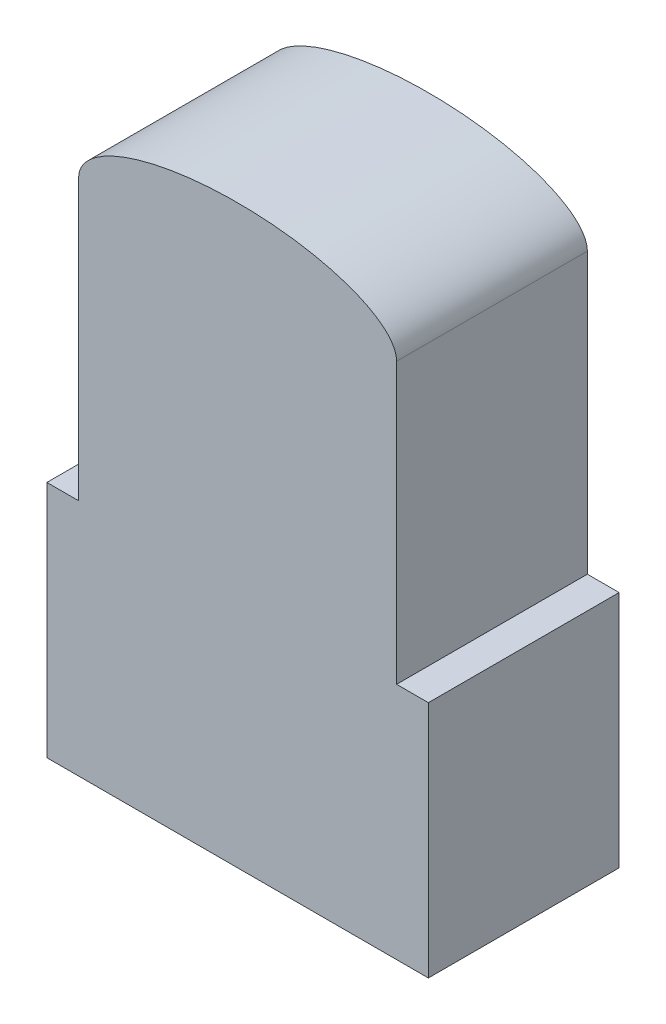
ISO-10303-21;
HEADER;
FILE_DESCRIPTION(('STEP AP214'),'2;1');
FILE_NAME('part.step','',(''),(''),'','','');
FILE_SCHEMA(('AUTOMOTIVE_DESIGN { 1 0 10303 214 1 1 1 1 }'));
ENDSEC;
DATA;
#1=APPLICATION_CONTEXT('core data for automotive mechanical design processes');
#2=APPLICATION_PROTOCOL_DEFINITION('international standard','automotive_design',2000,#1);
#3=PRODUCT_CONTEXT('',#1,'mechanical');
#4=PRODUCT('Part','Part','',(#3));
#5=PRODUCT_RELATED_PRODUCT_CATEGORY('part','',(#4));
#6=PRODUCT_DEFINITION_FORMATION('','',#4);
#7=PRODUCT_DEFINITION_CONTEXT('part definition',#1,'design');
#8=PRODUCT_DEFINITION('design','',#6,#7);
#9=PRODUCT_DEFINITION_SHAPE('','',#8);
#10=(LENGTH_UNIT() NAMED_UNIT(*) SI_UNIT(.MILLI.,.METRE.));
#11=(NAMED_UNIT(*) PLANE_ANGLE_UNIT() SI_UNIT($,.RADIAN.));
#12=(NAMED_UNIT(*) SI_UNIT($,.STERADIAN.) SOLID_ANGLE_UNIT());
#13=UNCERTAINTY_MEASURE_WITH_UNIT(LENGTH_MEASURE(1.E-05),#10,'distance_accuracy_value','');
#14=(GEOMETRIC_REPRESENTATION_CONTEXT(3) GLOBAL_UNCERTAINTY_ASSIGNED_CONTEXT((#13)) GLOBAL_UNIT_ASSIGNED_CONTEXT((#10,
#11,#12)) REPRESENTATION_CONTEXT('',''));
#15=CARTESIAN_POINT('',(0.,0.,0.));
#16=DIRECTION('',(0.,0.,1.));
#17=DIRECTION('',(1.,0.,0.));
#18=AXIS2_PLACEMENT_3D('',#15,#16,#17);
#19=CARTESIAN_POINT('',(177.8786838273,141.5356084214,3.));
#20=DIRECTION('',(0.,0.,1.));
#21=DIRECTION('',(1.,0.,0.));
#22=AXIS2_PLACEMENT_3D('',#19,#20,#21);
#23=ELLIPSE('',#22,2.5,0.909487208999998);
#24=DIRECTION('',(0.,0.,-1.));
#25=VECTOR('',#24,1.);
#26=SURFACE_OF_LINEAR_EXTRUSION('',#23,#25);
#27=CARTESIAN_POINT('',(177.8786838273,141.5356084214,0.));
#28=DIRECTION('',(0.,0.,1.));
#29=DIRECTION('',(1.,0.,0.));
#30=AXIS2_PLACEMENT_3D('',#27,#28,#29);
#31=ELLIPSE('',#30,2.5,0.909487208999998);
#32=CARTESIAN_POINT('',(180.3786838273,141.5356084214,0.));
#33=VERTEX_POINT('',#32);
#34=CARTESIAN_POINT('',(175.3786838273,141.5356084214,0.));
#35=VERTEX_POINT('',#34);
#36=EDGE_CURVE('E130',#33,#35,#31,.T.);
#37=ORIENTED_EDGE('',*,*,#36,.T.);
#38=DIRECTION('',(0.,0.,-1.));
#39=VECTOR('',#38,1.);
#40=CARTESIAN_POINT('',(175.3786838273,141.5356084214,3.));
#41=LINE('',#40,#39);
#42=CARTESIAN_POINT('',(175.3786838273,141.5356084214,3.));
#43=VERTEX_POINT('',#42);
#44=EDGE_CURVE('E11',#43,#35,#41,.T.);
#45=ORIENTED_EDGE('',*,*,#44,.F.);
#46=CARTESIAN_POINT('',(180.3786838273,141.5356084214,3.));
#47=VERTEX_POINT('',#46);
#48=EDGE_CURVE('E144',#47,#43,#23,.T.);
#49=ORIENTED_EDGE('',*,*,#48,.F.);
#50=DIRECTION('',(0.,0.,-1.));
#51=VECTOR('',#50,1.);
#52=CARTESIAN_POINT('',(180.3786838273,141.5356084214,3.));
#53=LINE('',#52,#51);
#54=EDGE_CURVE('E126',#47,#33,#53,.T.);
#55=ORIENTED_EDGE('',*,*,#54,.T.);
#56=EDGE_LOOP('',(#37,#45,#49,#55));
#57=FACE_BOUND('',#56,.T.);
#58=ADVANCED_FACE('F33',(#57),#26,.F.);
#59=CARTESIAN_POINT('',(175.3786838273,141.5356084214,3.));
#60=DIRECTION('',(1.,0.,0.));
#61=DIRECTION('',(0.,0.,-1.));
#62=AXIS2_PLACEMENT_3D('',#59,#60,#61);
#63=PLANE('',#62);
#64=DIRECTION('',(0.,-1.,0.));
#65=VECTOR('',#64,1.);
#66=CARTESIAN_POINT('',(175.3786838273,141.5356084214,0.));
#67=LINE('',#66,#65);
#68=CARTESIAN_POINT('',(175.3786838273,137.1356084214,0.));
#69=VERTEX_POINT('',#68);
#70=EDGE_CURVE('E133',#35,#69,#67,.T.);
#71=ORIENTED_EDGE('',*,*,#70,.T.);
#72=DIRECTION('',(0.,0.,-1.));
#73=VECTOR('',#72,1.);
#74=CARTESIAN_POINT('',(175.3786838273,137.1356084214,3.));
#75=LINE('',#74,#73);
#76=CARTESIAN_POINT('',(175.3786838273,137.1356084214,3.));
#77=VERTEX_POINT('',#76);
#78=EDGE_CURVE('E42',#77,#69,#75,.T.);
#79=ORIENTED_EDGE('',*,*,#78,.F.);
#80=DIRECTION('',(0.,-1.,0.));
#81=VECTOR('',#80,1.);
#82=CARTESIAN_POINT('',(175.3786838273,141.5356084214,3.));
#83=LINE('',#82,#81);
#84=EDGE_CURVE('E93',#43,#77,#83,.T.);
#85=ORIENTED_EDGE('',*,*,#84,.F.);
#86=ORIENTED_EDGE('',*,*,#44,.T.);
#87=EDGE_LOOP('',(#71,#79,#85,#86));
#88=FACE_BOUND('',#87,.T.);
#89=ADVANCED_FACE('F179',(#88),#63,.F.);
#90=CARTESIAN_POINT('',(175.3786838273,137.1356084214,3.));
#91=DIRECTION('',(0.,-1.,0.));
#92=DIRECTION('',(0.,0.,-1.));
#93=AXIS2_PLACEMENT_3D('',#90,#91,#92);
#94=PLANE('',#93);
#95=DIRECTION('',(-1.,0.,0.));
#96=VECTOR('',#95,1.);
#97=CARTESIAN_POINT('',(175.3786838273,137.1356084214,0.));
#98=LINE('',#97,#96);
#99=CARTESIAN_POINT('',(174.8786838273,137.1356084214,0.));
#100=VERTEX_POINT('',#99);
#101=EDGE_CURVE('E135',#69,#100,#98,.T.);
#102=ORIENTED_EDGE('',*,*,#101,.T.);
#103=DIRECTION('',(0.,0.,-1.));
#104=VECTOR('',#103,1.);
#105=CARTESIAN_POINT('',(174.8786838273,137.1356084214,3.));
#106=LINE('',#105,#104);
#107=CARTESIAN_POINT('',(174.8786838273,137.1356084214,3.));
#108=VERTEX_POINT('',#107);
#109=EDGE_CURVE('E151',#108,#100,#106,.T.);
#110=ORIENTED_EDGE('',*,*,#109,.F.);
#111=DIRECTION('',(-1.,0.,0.));
#112=VECTOR('',#111,1.);
#113=CARTESIAN_POINT('',(175.3786838273,137.1356084214,3.));
#114=LINE('',#113,#112);
#115=EDGE_CURVE('E159',#77,#108,#114,.T.);
#116=ORIENTED_EDGE('',*,*,#115,.F.);
#117=ORIENTED_EDGE('',*,*,#78,.T.);
#118=EDGE_LOOP('',(#102,#110,#116,#117));
#119=FACE_BOUND('',#118,.T.);
#120=ADVANCED_FACE('F157',(#119),#94,.F.);
#121=CARTESIAN_POINT('',(174.8786838273,137.1356084214,3.));
#122=DIRECTION('',(1.,0.,0.));
#123=DIRECTION('',(0.,0.,-1.));
#124=AXIS2_PLACEMENT_3D('',#121,#122,#123);
#125=PLANE('',#124);
#126=DIRECTION('',(0.,-1.,0.));
#127=VECTOR('',#126,1.);
#128=CARTESIAN_POINT('',(174.8786838273,137.1356084214,0.));
#129=LINE('',#128,#127);
#130=CARTESIAN_POINT('',(174.8786838273,133.3856084214,0.));
#131=VERTEX_POINT('',#130);
#132=EDGE_CURVE('E137',#100,#131,#129,.T.);
#133=ORIENTED_EDGE('',*,*,#132,.T.);
#134=DIRECTION('',(0.,0.,-1.));
#135=VECTOR('',#134,1.);
#136=CARTESIAN_POINT('',(174.8786838273,133.3856084214,3.));
#137=LINE('',#136,#135);
#138=CARTESIAN_POINT('',(174.8786838273,133.3856084214,3.));
#139=VERTEX_POINT('',#138);
#140=EDGE_CURVE('E148',#139,#131,#137,.T.);
#141=ORIENTED_EDGE('',*,*,#140,.F.);
#142=DIRECTION('',(0.,-1.,0.));
#143=VECTOR('',#142,1.);
#144=CARTESIAN_POINT('',(174.8786838273,137.1356084214,3.));
#145=LINE('',#144,#143);
#146=EDGE_CURVE('E171',#108,#139,#145,.T.);
#147=ORIENTED_EDGE('',*,*,#146,.F.);
#148=ORIENTED_EDGE('',*,*,#109,.T.);
#149=EDGE_LOOP('',(#133,#141,#147,#148));
#150=FACE_BOUND('',#149,.T.);
#151=ADVANCED_FACE('F167',(#150),#125,.F.);
#152=CARTESIAN_POINT('',(174.8786838273,133.3856084214,3.));
#153=DIRECTION('',(0.,1.,0.));
#154=DIRECTION('',(0.,0.,1.));
#155=AXIS2_PLACEMENT_3D('',#152,#153,#154);
#156=PLANE('',#155);
#157=DIRECTION('',(1.,0.,0.));
#158=VECTOR('',#157,1.);
#159=CARTESIAN_POINT('',(174.8786838273,133.3856084214,0.));
#160=LINE('',#159,#158);
#161=CARTESIAN_POINT('',(180.8786838273,133.3856084214,0.));
#162=VERTEX_POINT('',#161);
#163=EDGE_CURVE('E139',#131,#162,#160,.T.);
#164=ORIENTED_EDGE('',*,*,#163,.T.);
#165=DIRECTION('',(0.,0.,-1.));
#166=VECTOR('',#165,1.);
#167=CARTESIAN_POINT('',(180.8786838273,133.3856084214,3.));
#168=LINE('',#167,#166);
#169=CARTESIAN_POINT('',(180.8786838273,133.3856084214,3.));
#170=VERTEX_POINT('',#169);
#171=EDGE_CURVE('E121',#170,#162,#168,.T.);
#172=ORIENTED_EDGE('',*,*,#171,.F.);
#173=DIRECTION('',(1.,0.,0.));
#174=VECTOR('',#173,1.);
#175=CARTESIAN_POINT('',(174.8786838273,133.3856084214,3.));
#176=LINE('',#175,#174);
#177=EDGE_CURVE('E112',#139,#170,#176,.T.);
#178=ORIENTED_EDGE('',*,*,#177,.F.);
#179=ORIENTED_EDGE('',*,*,#140,.T.);
#180=EDGE_LOOP('',(#164,#172,#178,#179));
#181=FACE_BOUND('',#180,.T.);
#182=ADVANCED_FACE('F170',(#181),#156,.F.);
#183=CARTESIAN_POINT('',(180.8786838273,133.3856084214,3.));
#184=DIRECTION('',(-1.,0.,0.));
#185=DIRECTION('',(0.,0.,1.));
#186=AXIS2_PLACEMENT_3D('',#183,#184,#185);
#187=PLANE('',#186);
#188=DIRECTION('',(0.,1.,0.));
#189=VECTOR('',#188,1.);
#190=CARTESIAN_POINT('',(180.8786838273,133.3856084214,0.));
#191=LINE('',#190,#189);
#192=CARTESIAN_POINT('',(180.8786838273,137.1356084214,0.));
#193=VERTEX_POINT('',#192);
#194=EDGE_CURVE('E120',#162,#193,#191,.T.);
#195=ORIENTED_EDGE('',*,*,#194,.T.);
#196=DIRECTION('',(0.,0.,-1.));
#197=VECTOR('',#196,1.);
#198=CARTESIAN_POINT('',(180.8786838273,137.1356084214,3.));
#199=LINE('',#198,#197);
#200=CARTESIAN_POINT('',(180.8786838273,137.1356084214,3.));
#201=VERTEX_POINT('',#200);
#202=EDGE_CURVE('E117',#201,#193,#199,.T.);
#203=ORIENTED_EDGE('',*,*,#202,.F.);
#204=DIRECTION('',(0.,1.,0.));
#205=VECTOR('',#204,1.);
#206=CARTESIAN_POINT('',(180.8786838273,133.3856084214,3.));
#207=LINE('',#206,#205);
#208=EDGE_CURVE('E106',#170,#201,#207,.T.);
#209=ORIENTED_EDGE('',*,*,#208,.F.);
#210=ORIENTED_EDGE('',*,*,#171,.T.);
#211=EDGE_LOOP('',(#195,#203,#209,#210));
#212=FACE_BOUND('',#211,.T.);
#213=ADVANCED_FACE('F118',(#212),#187,.F.);
#214=CARTESIAN_POINT('',(180.8786838273,137.1356084214,3.));
#215=DIRECTION('',(0.,-1.,0.));
#216=DIRECTION('',(0.,0.,-1.));
#217=AXIS2_PLACEMENT_3D('',#214,#215,#216);
#218=PLANE('',#217);
#219=DIRECTION('',(-1.,0.,0.));
#220=VECTOR('',#219,1.);
#221=CARTESIAN_POINT('',(180.8786838273,137.1356084214,0.));
#222=LINE('',#221,#220);
#223=CARTESIAN_POINT('',(180.3786838273,137.1356084214,0.));
#224=VERTEX_POINT('',#223);
#225=EDGE_CURVE('E79',#193,#224,#222,.T.);
#226=ORIENTED_EDGE('',*,*,#225,.T.);
#227=DIRECTION('',(0.,0.,-1.));
#228=VECTOR('',#227,1.);
#229=CARTESIAN_POINT('',(180.3786838273,137.1356084214,3.));
#230=LINE('',#229,#228);
#231=CARTESIAN_POINT('',(180.3786838273,137.1356084214,3.));
#232=VERTEX_POINT('',#231);
#233=EDGE_CURVE('E122',#232,#224,#230,.T.);
#234=ORIENTED_EDGE('',*,*,#233,.F.);
#235=DIRECTION('',(-1.,0.,0.));
#236=VECTOR('',#235,1.);
#237=CARTESIAN_POINT('',(180.8786838273,137.1356084214,3.));
#238=LINE('',#237,#236);
#239=EDGE_CURVE('E110',#201,#232,#238,.T.);
#240=ORIENTED_EDGE('',*,*,#239,.F.);
#241=ORIENTED_EDGE('',*,*,#202,.T.);
#242=EDGE_LOOP('',(#226,#234,#240,#241));
#243=FACE_BOUND('',#242,.T.);
#244=ADVANCED_FACE('F124',(#243),#218,.F.);
#245=CARTESIAN_POINT('',(180.3786838273,137.1356084214,3.));
#246=DIRECTION('',(-1.,0.,0.));
#247=DIRECTION('',(0.,0.,1.));
#248=AXIS2_PLACEMENT_3D('',#245,#246,#247);
#249=PLANE('',#248);
#250=DIRECTION('',(0.,1.,0.));
#251=VECTOR('',#250,1.);
#252=CARTESIAN_POINT('',(180.3786838273,137.1356084214,0.));
#253=LINE('',#252,#251);
#254=EDGE_CURVE('E85',#224,#33,#253,.T.);
#255=ORIENTED_EDGE('',*,*,#254,.T.);
#256=ORIENTED_EDGE('',*,*,#54,.F.);
#257=DIRECTION('',(0.,1.,0.));
#258=VECTOR('',#257,1.);
#259=CARTESIAN_POINT('',(180.3786838273,137.1356084214,3.));
#260=LINE('',#259,#258);
#261=EDGE_CURVE('E50',#232,#47,#260,.T.);
#262=ORIENTED_EDGE('',*,*,#261,.F.);
#263=ORIENTED_EDGE('',*,*,#233,.T.);
#264=EDGE_LOOP('',(#255,#256,#262,#263));
#265=FACE_BOUND('',#264,.T.);
#266=ADVANCED_FACE('F195',(#265),#249,.F.);
#267=CARTESIAN_POINT('',(177.8786838273,141.5356084214,3.));
#268=DIRECTION('',(0.,0.,1.));
#269=DIRECTION('',(1.,0.,0.));
#270=AXIS2_PLACEMENT_3D('',#267,#268,#269);
#271=PLANE('',#270);
#272=ORIENTED_EDGE('',*,*,#48,.T.);
#273=ORIENTED_EDGE('',*,*,#84,.T.);
#274=ORIENTED_EDGE('',*,*,#115,.T.);
#275=ORIENTED_EDGE('',*,*,#146,.T.);
#276=ORIENTED_EDGE('',*,*,#177,.T.);
#277=ORIENTED_EDGE('',*,*,#208,.T.);
#278=ORIENTED_EDGE('',*,*,#239,.T.);
#279=ORIENTED_EDGE('',*,*,#261,.T.);
#280=EDGE_LOOP('',(#272,#273,#274,#275,#276,#277,#278,#279));
#281=FACE_BOUND('',#280,.T.);
#282=ADVANCED_FACE('F108',(#281),#271,.T.);
#283=CARTESIAN_POINT('',(177.8786838273,141.5356084214,0.));
#284=DIRECTION('',(0.,0.,1.));
#285=DIRECTION('',(1.,0.,0.));
#286=AXIS2_PLACEMENT_3D('',#283,#284,#285);
#287=PLANE('',#286);
#288=ORIENTED_EDGE('',*,*,#36,.F.);
#289=ORIENTED_EDGE('',*,*,#254,.F.);
#290=ORIENTED_EDGE('',*,*,#225,.F.);
#291=ORIENTED_EDGE('',*,*,#194,.F.);
#292=ORIENTED_EDGE('',*,*,#163,.F.);
#293=ORIENTED_EDGE('',*,*,#132,.F.);
#294=ORIENTED_EDGE('',*,*,#101,.F.);
#295=ORIENTED_EDGE('',*,*,#70,.F.);
#296=EDGE_LOOP('',(#288,#289,#290,#291,#292,#293,#294,#295));
#297=FACE_BOUND('',#296,.T.);
#298=ADVANCED_FACE('F163',(#297),#287,.F.);
#299=CLOSED_SHELL('',(#58,#89,#120,#151,#182,#213,#244,#266,#282,#298));
#300=MANIFOLD_SOLID_BREP('B2',#299);
#301=ADVANCED_BREP_SHAPE_REPRESENTATION('',(#18,#300),#14);
#302=SHAPE_DEFINITION_REPRESENTATION(#9,#301);
ENDSEC;
END-ISO-10303-21;
